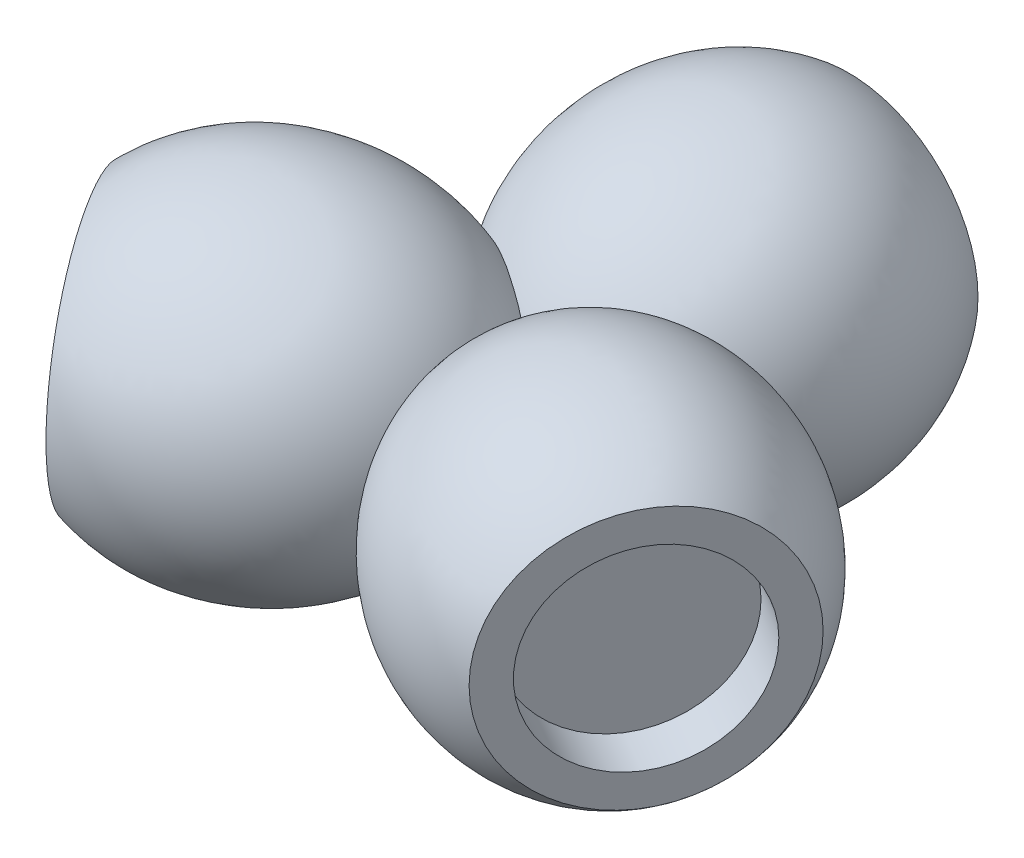
ISO-10303-21;
HEADER;
FILE_DESCRIPTION(('STEP AP214'),'2;1');
FILE_NAME('part.step','',(''),(''),'','','');
FILE_SCHEMA(('AUTOMOTIVE_DESIGN { 1 0 10303 214 1 1 1 1 }'));
ENDSEC;
DATA;
#1=APPLICATION_CONTEXT('core data for automotive mechanical design processes');
#2=APPLICATION_PROTOCOL_DEFINITION('international standard','automotive_design',2000,#1);
#3=PRODUCT_CONTEXT('',#1,'mechanical');
#4=PRODUCT('Part','Part','',(#3));
#5=PRODUCT_RELATED_PRODUCT_CATEGORY('part','',(#4));
#6=PRODUCT_DEFINITION_FORMATION('','',#4);
#7=PRODUCT_DEFINITION_CONTEXT('part definition',#1,'design');
#8=PRODUCT_DEFINITION('design','',#6,#7);
#9=PRODUCT_DEFINITION_SHAPE('','',#8);
#10=(LENGTH_UNIT() NAMED_UNIT(*) SI_UNIT(.MILLI.,.METRE.));
#11=(NAMED_UNIT(*) PLANE_ANGLE_UNIT() SI_UNIT($,.RADIAN.));
#12=(NAMED_UNIT(*) SI_UNIT($,.STERADIAN.) SOLID_ANGLE_UNIT());
#13=UNCERTAINTY_MEASURE_WITH_UNIT(LENGTH_MEASURE(1.E-05),#10,'distance_accuracy_value','');
#14=(GEOMETRIC_REPRESENTATION_CONTEXT(3) GLOBAL_UNCERTAINTY_ASSIGNED_CONTEXT((#13)) GLOBAL_UNIT_ASSIGNED_CONTEXT((#10,
#11,#12)) REPRESENTATION_CONTEXT('',''));
#15=CARTESIAN_POINT('',(0.,0.,0.));
#16=DIRECTION('',(0.,0.,1.));
#17=DIRECTION('',(1.,0.,0.));
#18=AXIS2_PLACEMENT_3D('',#15,#16,#17);
#19=CARTESIAN_POINT('',(1.21746964497283E-12,0.,111.46260013653));
#20=CARTESIAN_POINT('',(0.119663795632793,0.,111.46260013653));
#21=CARTESIAN_POINT('',(0.359418154572468,0.,111.460806702534));
#22=CARTESIAN_POINT('',(0.813396549933653,0.,111.452736250165));
#23=CARTESIAN_POINT('',(1.29199210676911,0.,111.431224933905));
#24=CARTESIAN_POINT('',(1.77179781540944,0.,111.403012927112));
#25=CARTESIAN_POINT('',(2.15418146175772,0.,111.372142779226));
#26=CARTESIAN_POINT('',(2.54742862141491,0.,111.335936552702));
#27=CARTESIAN_POINT('',(2.93713214133951,0.,111.29440521904));
#28=CARTESIAN_POINT('',(3.39173716178687,0.,111.238212731978));
#29=CARTESIAN_POINT('',(4.03916241382257,0.,111.144742729388));
#30=CARTESIAN_POINT('',(4.81289619622294,0.,111.011600029192));
#31=CARTESIAN_POINT('',(5.70991812439508,0.,110.826003494658));
#32=CARTESIAN_POINT('',(6.97978766455311,0.,110.509904393202));
#33=CARTESIAN_POINT('',(8.48204632926122,0.,110.050755161886));
#34=CARTESIAN_POINT('',(9.952102864366,0.,109.4954279195));
#35=CARTESIAN_POINT('',(11.6225674906414,0.,108.741947993922));
#36=CARTESIAN_POINT('',(13.2441001360033,0.,107.888296829864));
#37=CARTESIAN_POINT('',(14.8128252575007,0.,106.94005690529));
#38=CARTESIAN_POINT('',(16.5277569618532,0.,105.737112094324));
#39=CARTESIAN_POINT('',(18.1607810620796,0.,104.425339584756));
#40=CARTESIAN_POINT('',(19.7091654695573,0.,103.014848365321));
#41=CARTESIAN_POINT('',(21.171272091536,0.,101.515265025055));
#42=CARTESIAN_POINT('',(22.5463386816813,0.,99.9356371776898));
#43=CARTESIAN_POINT('',(24.1563398195087,0.,97.8715430642102));
#44=CARTESIAN_POINT('',(25.7407367747211,0.,95.5252173081264));
#45=CARTESIAN_POINT('',(27.2622876513046,0.,92.8895687010557));
#46=CARTESIAN_POINT('',(28.59156814644,0.,90.1532653790211));
#47=CARTESIAN_POINT('',(29.5695468367407,0.,87.8330112832781));
#48=CARTESIAN_POINT('',(30.5488001817823,0.,85.1787856860964));
#49=CARTESIAN_POINT('',(31.4832931808287,0.,82.1793690635095));
#50=CARTESIAN_POINT('',(32.3588598659516,0.,78.619288625444));
#51=CARTESIAN_POINT('',(33.2590132044147,0.,73.4602814236018));
#52=CARTESIAN_POINT('',(33.8042518059979,0.,67.1946078311029));
#53=CARTESIAN_POINT('',(33.7131138721134,0.,59.8530907527881));
#54=CARTESIAN_POINT('',(32.6919746751706,0.,51.5268964861419));
#55=CARTESIAN_POINT('',(30.8192032286581,0.,43.3515740901067));
#56=CARTESIAN_POINT('',(28.1468373255789,0.,35.4024830158736));
#57=CARTESIAN_POINT('',(24.7148897427776,0.,27.7507860460519));
#58=CARTESIAN_POINT('',(21.0719802606443,0.,21.3806075933545));
#59=CARTESIAN_POINT('',(17.5018261958731,0.,16.2063104946718));
#60=CARTESIAN_POINT('',(14.2271665120468,0.,12.1209880445207));
#61=CARTESIAN_POINT('',(11.7754989726939,0.,9.3963927044084));
#62=CARTESIAN_POINT('',(9.55698811010727,0.,7.17262355469425));
#63=CARTESIAN_POINT('',(7.76919538259728,0.,5.53549047653436));
#64=CARTESIAN_POINT('',(6.47339406391217,0.,4.42326079817697));
#65=CARTESIAN_POINT('',(5.03799194636458,0.,3.26393122614762));
#66=CARTESIAN_POINT('',(3.82810988961921,0.,2.35734358756431));
#67=CARTESIAN_POINT('',(2.70089524588899,0.,1.5761044842962));
#68=CARTESIAN_POINT('',(1.66134522589941,0.,0.917684938021807));
#69=CARTESIAN_POINT('',(1.0905943440891,0.,0.577144213723487));
#70=CARTESIAN_POINT('',(0.593460457008534,0.,0.298966802230689));
#71=CARTESIAN_POINT('',(0.256786725815097,0.,0.123170174141032));
#72=CARTESIAN_POINT('',(0.0860041808827817,0.,0.0402285197195553));
#73=CARTESIAN_POINT('',(0.,0.,0.));
#74=B_SPLINE_CURVE_WITH_KNOTS('',4,(#19,#20,#21,#22,#23,#24,#25,#26,#27,#28,#29,#30,#31,#32,#33,
#34,#35,#36,#37,#38,#39,#40,#41,#42,#43,#44,#45,#46,#47,#48,#49,#50,#51,#52,#53,#54,#55,#56,#57,
#58,#59,#60,#61,#62,#63,#64,#65,#66,#67,#68,#69,#70,#71,#72,#73),.UNSPECIFIED.,.F.,.F.,(5,1,1,1,
1,1,1,1,1,1,1,1,1,1,1,1,1,1,1,1,1,1,1,1,1,1,1,1,1,1,1,1,1,1,1,1,1,1,1,1,1,1,1,1,1,1,1,1,1,1,1,
5),(0.0853246715427618,0.0887485509040368,0.0921724302653117,0.0955963096265867,
0.0990201889878616,0.100732128668499,0.102444068349137,0.105867947710412,0.109291827071686,
0.112715706432961,0.119563473031121,0.12641123962928,0.133259006227439,0.14695454522692,
0.160650090029563,0.167497862430884,0.181193345776511,0.194888829122138,0.208584415628072,
0.222280002134007,0.235975530838741,0.249671059543476,0.263366620179581,0.277062180815685,
0.304453170294509,0.323693004216435,0.342932838138361,0.356628382317244,0.370323926496127,
0.397715014853894,0.425106104514257,0.45249719417462,0.507279373703119,0.562061567924162,
0.616843748917064,0.67162593046471,0.726408051134821,0.781190345492604,0.835972549580629,
0.863363608938114,0.8907546682956,0.918145813941736,0.931841386764804,0.945536959587871,
0.954183704686658,0.962830449785445,0.980123939983018,0.985092954987263,0.990061969991509,
0.995030984995754,0.997515492497877,1.),.UNSPECIFIED.);
#75=CARTESIAN_POINT('',(0.,0.,0.));
#76=DIRECTION('',(0.,0.,-1.));
#77=AXIS1_PLACEMENT('',#75,#76);
#78=SURFACE_OF_REVOLUTION('',#74,#77);
#79=CARTESIAN_POINT('',(0.,0.,0.));
#80=VERTEX_POINT('',#79);
#81=VERTEX_LOOP('',#80);
#82=FACE_BOUND('',#81,.T.);
#83=CARTESIAN_POINT('',(0.,0.,111.46260013653));
#84=VERTEX_POINT('',#83);
#85=VERTEX_LOOP('',#84);
#86=FACE_BOUND('',#85,.T.);
#87=ADVANCED_FACE('P0_F16',(#82,#86),#78,.T.);
#88=CLOSED_SHELL('',(#87));
#89=MANIFOLD_SOLID_BREP('P0_B1',#88);
#90=CARTESIAN_POINT('',(0.,0.,0.));
#91=CARTESIAN_POINT('',(0.043830976130994,0.,0.0186791363310697));
#92=CARTESIAN_POINT('',(0.131974543979919,0.,0.0548378624464019));
#93=CARTESIAN_POINT('',(0.31022763523346,0.,0.122268555270368));
#94=CARTESIAN_POINT('',(0.670407337037751,0.,0.246977058198205));
#95=CARTESIAN_POINT('',(1.17142801003007,0.,0.400964352623035));
#96=CARTESIAN_POINT('',(1.81561581344275,0.,0.574205655000247));
#97=CARTESIAN_POINT('',(2.75085990380028,0.,0.7924162138733));
#98=CARTESIAN_POINT('',(3.8882458320896,0.,1.0127469204612));
#99=CARTESIAN_POINT('',(5.22919551712919,0.,1.21839888894545));
#100=CARTESIAN_POINT('',(6.77394931813752,0.,1.39284942327746));
#101=CARTESIAN_POINT('',(8.72532477994025,0.,1.54457831731911));
#102=CARTESIAN_POINT('',(11.0842847706564,0.,1.6281822498997));
#103=CARTESIAN_POINT('',(13.6441193424084,0.,1.60015484439841));
#104=CARTESIAN_POINT('',(16.398680633937,0.,1.44637657097625));
#105=CARTESIAN_POINT('',(19.5281539189791,0.,1.1548953203217));
#106=CARTESIAN_POINT('',(23.0243882545599,0.,0.682393983639629));
#107=CARTESIAN_POINT('',(27.0730604900188,0.,-0.0615872578854551));
#108=CARTESIAN_POINT('',(32.7936771558061,0.,-1.4223647519291));
#109=CARTESIAN_POINT('',(39.5430024310636,0.,-3.49089860816371));
#110=CARTESIAN_POINT('',(47.2245291139392,0.,-6.46735147429374));
#111=CARTESIAN_POINT('',(57.5562927937646,0.,-11.4363848691124));
#112=CARTESIAN_POINT('',(69.4027369692584,0.,-18.5710285506906));
#113=CARTESIAN_POINT('',(82.2967202987623,0.,-28.3725054942802));
#114=CARTESIAN_POINT('',(95.6199182335728,0.,-41.2795774666161));
#115=CARTESIAN_POINT('',(107.563224066596,0.,-55.8609472479338));
#116=CARTESIAN_POINT('',(117.827965423516,0.,-71.6658797242835));
#117=CARTESIAN_POINT('',(126.341324726231,0.,-88.4773133468858));
#118=CARTESIAN_POINT('',(133.036982051647,0.,-106.090936874956));
#119=CARTESIAN_POINT('',(137.252240905113,0.,-122.030733415426));
#120=CARTESIAN_POINT('',(139.657409359358,0.,-135.946181249383));
#121=CARTESIAN_POINT('',(140.841675986377,0.,-147.647372298136));
#122=CARTESIAN_POINT('',(141.291720366522,0.,-157.045426617269));
#123=CARTESIAN_POINT('',(141.233130837806,0.,-167.630271044416));
#124=CARTESIAN_POINT('',(140.42987636832,0.,-179.367359109796));
#125=CARTESIAN_POINT('',(138.941593194893,0.,-189.854188373775));
#126=CARTESIAN_POINT('',(137.020196404185,0.,-199.065653138572));
#127=CARTESIAN_POINT('',(135.258491664991,0.,-205.896350548171));
#128=CARTESIAN_POINT('',(133.955832387977,0.,-210.415164030316));
#129=CARTESIAN_POINT('',(132.5251616505,0.,-214.895091140581));
#130=CARTESIAN_POINT('',(130.966717722194,0.,-219.332220248478));
#131=CARTESIAN_POINT('',(129.280902335316,0.,-223.722506087244));
#132=CARTESIAN_POINT('',(127.69471036426,0.,-227.519557360189));
#133=CARTESIAN_POINT('',(126.256215149428,0.,-230.739744237555));
#134=CARTESIAN_POINT('',(124.754699009714,0.,-233.931037787412));
#135=CARTESIAN_POINT('',(123.451366323489,0.,-236.565139378214));
#136=CARTESIAN_POINT('',(122.095661560921,0.,-239.173327922019));
#137=CARTESIAN_POINT('',(120.407390083382,0.,-242.269136840017));
#138=CARTESIAN_POINT('',(118.656323389429,0.,-245.331912569755));
#139=CARTESIAN_POINT('',(116.830397080705,0.,-248.347471588187));
#140=CARTESIAN_POINT('',(114.925598842458,0.,-251.319153061921));
#141=CARTESIAN_POINT('',(113.292165698358,0.,-253.757347639572));
#142=CARTESIAN_POINT('',(112.115819327361,0.,-255.454750297579));
#143=CARTESIAN_POINT('',(111.101943834626,0.,-256.880227693953));
#144=CARTESIAN_POINT('',(110.202837030668,0.,-258.114214128868));
#145=CARTESIAN_POINT('',(109.493385846108,0.,-259.075677100228));
#146=CARTESIAN_POINT('',(108.670260494782,0.,-260.164838088381));
#147=CARTESIAN_POINT('',(107.969459905131,0.,-261.083221772819));
#148=CARTESIAN_POINT('',(107.245854497313,0.,-262.007379494795));
#149=CARTESIAN_POINT('',(106.881328516675,0.,-262.469058983019));
#150=CARTESIAN_POINT('',(106.696233767227,0.,-262.701929072325));
#151=B_SPLINE_CURVE_WITH_KNOTS('',4,(#90,#91,#92,#93,#94,#95,#96,#97,#98,#99,#100,#101,#102,
#103,#104,#105,#106,#107,#108,#109,#110,#111,#112,#113,#114,#115,#116,#117,#118,#119,#120,#121,
#122,#123,#124,#125,#126,#127,#128,#129,#130,#131,#132,#133,#134,#135,#136,#137,#138,#139,#140,
#141,#142,#143,#144,#145,#146,#147,#148,#149,#150),.UNSPECIFIED.,.F.,.F.,(5,1,1,1,1,1,1,1,1,1,1,
1,1,1,1,1,1,1,1,1,1,1,1,1,1,1,1,1,1,1,1,1,1,1,1,1,1,1,1,1,1,1,1,1,1,1,1,1,1,1,1,1,1,1,1,1,1,5),
(0.,0.000496676085382172,0.000993352170764345,0.00198670434152869,0.00397340868305738,
0.00596011302458607,0.00794681736611476,0.0119979252521332,0.0160490331381516,0.02010014102417,
0.0241512489101885,0.0324007889414404,0.0406503289726922,0.046778870002393,0.0529074110320937,
0.0651644930914951,0.0774205810890931,0.0896766690866912,0.114189811680301,0.138702404650163,
0.163215230713746,0.209093251875566,0.258118854313432,0.307144114402691,0.356169607835554,
0.405195108308226,0.454220504059607,0.503245934244853,0.552271367805309,0.576784105575738,
0.601296843346166,0.625809560474281,0.650322277602395,0.687091361319528,0.723860440566191,
0.736116799570001,0.74837315857381,0.760629519262714,0.772885879951618,0.785142240640521,
0.797398601329425,0.809654959802713,0.815783139039357,0.821911318276001,0.834167676749288,
0.840295855985932,0.846424035222576,0.858680391039599,0.870936746856622,0.877064924765134,
0.883193102673645,0.889321280582157,0.892385369536413,0.895449458490668,0.898861033442164,
0.902272608393659,0.905684183345154,0.90909575829665),.UNSPECIFIED.);
#152=CARTESIAN_POINT('',(3.40249342327014E-12,0.,737.298070927678));
#153=DIRECTION('',(0.,0.,1.));
#154=AXIS1_PLACEMENT('',#152,#153);
#155=SURFACE_OF_REVOLUTION('',#151,#154);
#156=CARTESIAN_POINT('',(0.,0.,-262.701929072321));
#157=DIRECTION('',(0.,0.,1.));
#158=DIRECTION('',(1.,0.,0.));
#159=AXIS2_PLACEMENT_3D('',#156,#157,#158);
#160=CIRCLE('',#159,106.696233767229);
#161=CARTESIAN_POINT('',(106.696233767229,0.,-262.701929072322));
#162=VERTEX_POINT('',#161);
#163=EDGE_CURVE('P1_E11',#162,#162,#160,.T.);
#164=ORIENTED_EDGE('',*,*,#163,.T.);
#165=EDGE_LOOP('',(#164));
#166=FACE_BOUND('',#165,.T.);
#167=CARTESIAN_POINT('',(0.,0.,0.));
#168=VERTEX_POINT('',#167);
#169=VERTEX_LOOP('',#168);
#170=FACE_BOUND('',#169,.T.);
#171=ADVANCED_FACE('P1_F17',(#166,#170),#155,.F.);
#172=CARTESIAN_POINT('',(106.696233767229,0.,-262.701929072322));
#173=DIRECTION('',(0.,0.,-1.));
#174=DIRECTION('',(-1.,0.,0.));
#175=AXIS2_PLACEMENT_3D('',#172,#173,#174);
#176=PLANE('',#175);
#177=CARTESIAN_POINT('',(-9.01133029205691E-13,0.,-262.701929072321));
#178=DIRECTION('',(0.,0.,-1.));
#179=DIRECTION('',(-1.,0.,0.));
#180=AXIS2_PLACEMENT_3D('',#177,#178,#179);
#181=CIRCLE('',#180,80.);
#182=CARTESIAN_POINT('',(-80.0000000000009,0.,-262.701929072321));
#183=VERTEX_POINT('',#182);
#184=EDGE_CURVE('P1_E51',#183,#183,#181,.T.);
#185=ORIENTED_EDGE('',*,*,#184,.F.);
#186=EDGE_LOOP('',(#185));
#187=FACE_BOUND('',#186,.T.);
#188=ORIENTED_EDGE('',*,*,#163,.F.);
#189=EDGE_LOOP('',(#188));
#190=FACE_BOUND('',#189,.T.);
#191=ADVANCED_FACE('P1_F27',(#187,#190),#176,.T.);
#192=CARTESIAN_POINT('',(-7.6392306925026E-13,0.,-222.701929072321));
#193=DIRECTION('',(0.,0.,-1.));
#194=DIRECTION('',(-1.,0.,0.));
#195=AXIS2_PLACEMENT_3D('',#192,#193,#194);
#196=CYLINDRICAL_SURFACE('',#195,80.);
#197=CARTESIAN_POINT('',(-7.6392306925026E-13,0.,-222.701929072321));
#198=DIRECTION('',(0.,0.,-1.));
#199=DIRECTION('',(-1.,0.,0.));
#200=AXIS2_PLACEMENT_3D('',#197,#198,#199);
#201=CIRCLE('',#200,80.);
#202=CARTESIAN_POINT('',(-80.0000000000008,0.,-222.701929072321));
#203=VERTEX_POINT('',#202);
#204=EDGE_CURVE('P1_E23',#203,#203,#201,.T.);
#205=ORIENTED_EDGE('',*,*,#204,.F.);
#206=EDGE_LOOP('',(#205));
#207=FACE_BOUND('',#206,.T.);
#208=ORIENTED_EDGE('',*,*,#184,.T.);
#209=EDGE_LOOP('',(#208));
#210=FACE_BOUND('',#209,.T.);
#211=ADVANCED_FACE('P1_F33',(#207,#210),#196,.F.);
#212=CARTESIAN_POINT('',(-7.6392306925026E-13,0.,-222.701929072321));
#213=DIRECTION('',(0.,0.,-1.));
#214=DIRECTION('',(-1.,0.,0.));
#215=AXIS2_PLACEMENT_3D('',#212,#213,#214);
#216=PLANE('',#215);
#217=ORIENTED_EDGE('',*,*,#204,.T.);
#218=EDGE_LOOP('',(#217));
#219=FACE_BOUND('',#218,.T.);
#220=ADVANCED_FACE('P1_F40',(#219),#216,.T.);
#221=CLOSED_SHELL('',(#171,#191,#211,#220));
#222=MANIFOLD_SOLID_BREP('P1_B1',#221);
#223=CARTESIAN_POINT('',(96.5294432901014,0.,-55.7313000682667));
#224=CARTESIAN_POINT('',(96.4696113922855,0.,-55.8349319551969));
#225=CARTESIAN_POINT('',(96.3481810534147,0.,-56.0416686037085));
#226=CARTESIAN_POINT('',(96.1142026389624,0.,-56.430790200676));
#227=CARTESIAN_POINT('',(95.856275514195,0.,-56.834510452904));
#228=CARTESIAN_POINT('',(95.5919403453006,0.,-57.235928382071));
#229=CARTESIAN_POINT('',(95.3740141898384,0.,-57.5516472598572));
#230=CARTESIAN_POINT('',(95.1460350980644,0.,-57.8741061768242));
#231=CARTESIAN_POINT('',(94.9152161480982,0.,-58.1908336581923));
#232=CARTESIAN_POINT('',(94.6392495165768,0.,-58.5564369110566));
#233=CARTESIAN_POINT('',(94.2345894938244,0.,-59.0703886250762));
#234=CARTESIAN_POINT('',(93.732417641926,0.,-59.6738903863031));
#235=CARTESIAN_POINT('',(93.1231753640791,0.,-60.3579358965848));
#236=CARTESIAN_POINT('',(92.2144907420261,0.,-61.2996256271259));
#237=CARTESIAN_POINT('',(91.0657265112236,0.,-62.3710451781601));
#238=CARTESIAN_POINT('',(89.8497707443513,0.,-63.3664878613671));
#239=CARTESIAN_POINT('',(88.3620056744222,0.,-64.4364127010563));
#240=CARTESIAN_POINT('',(86.811955757696,0.,-65.413875582976));
#241=CARTESIAN_POINT('',(85.2063933333842,0.,-66.2983114274608));
#242=CARTESIAN_POINT('',(83.3071467155605,0.,-67.1820134437024));
#243=CARTESIAN_POINT('',(81.3546063481757,0.,-67.9403675447068));
#244=CARTESIAN_POINT('',(79.3588929165912,0.,-68.5760621666888));
#245=CARTESIAN_POINT('',(77.3291623378395,0.,-69.0924919742307));
#246=CARTESIAN_POINT('',(75.273631198423,0.,-69.4935206495091));
#247=CARTESIAN_POINT('',(72.6810726914341,0.,-69.8557754782496));
#248=CARTESIAN_POINT('',(69.8568965035055,0.,-70.0547406131003));
#249=CARTESIAN_POINT('',(66.8135824160415,0.,-70.0546180218367));
#250=CARTESIAN_POINT('',(63.7792339791321,0.,-69.8376570383619));
#251=CARTESIAN_POINT('',(61.2808456438333,0.,-69.5244843806506));
#252=CARTESIAN_POINT('',(58.4925921767783,0.,-69.0454298556067));
#253=CARTESIAN_POINT('',(55.4277746855616,0.,-68.355016221146));
#254=CARTESIAN_POINT('',(51.9068712441193,0.,-67.333238994137));
#255=CARTESIAN_POINT('',(46.9889632797856,0.,-65.5332910516264));
#256=CARTESIAN_POINT('',(41.2901114760686,0.,-62.8726447354718));
#257=CARTESIAN_POINT('',(34.977740150873,0.,-59.122958430322));
#258=CARTESIAN_POINT('',(28.2776139975844,0.,-54.0755288116463));
#259=CARTESIAN_POINT('',(22.1339628417464,0.,-48.3659999654667));
#260=CARTESIAN_POINT('',(16.586030986004,0.,-42.0771176680763));
#261=CARTESIAN_POINT('',(11.6754408194787,0.,-35.2791153920028));
#262=CARTESIAN_POINT('',(7.98015919386918,0.,-28.9391740104395));
#263=CARTESIAN_POINT('',(5.28416349206748,0.,-23.260181345582));
#264=CARTESIAN_POINT('',(3.38350030949888,0.,-18.3815816455641));
#265=CARTESIAN_POINT('',(2.2497652996054,0.,-14.8960776047947));
#266=CARTESIAN_POINT('',(1.43318015509418,0.,-11.8629062643659));
#267=CARTESIAN_POINT('',(0.909277683786906,0.,-9.49606580656119));
#268=CARTESIAN_POINT('',(0.593959186828962,0.,-7.81775410714382));
#269=CARTESIAN_POINT('',(0.30765138486681,0.,-5.99499462268695));
#270=CARTESIAN_POINT('',(0.127464487469413,0.,-4.49391220667084));
#271=CARTESIAN_POINT('',(0.0144988994745744,0.,-3.12709613804859));
#272=CARTESIAN_POINT('',(-0.0359341439524802,0.,-1.89760963909579));
#273=CARTESIAN_POINT('',(-0.0454756213128205,0.,-1.23305451406653));
#274=CARTESIAN_POINT('',(-0.0378173828842951,0.,-0.663435233026257));
#275=CARTESIAN_POINT('',(-0.0217248631128632,0.,-0.283968914981019));
#276=CARTESIAN_POINT('',(-0.00816317040761317,0.,-0.0945960653359386));
#277=CARTESIAN_POINT('',(0.,0.,0.));
#278=B_SPLINE_CURVE_WITH_KNOTS('',4,(#223,#224,#225,#226,#227,#228,#229,#230,#231,#232,#233,
#234,#235,#236,#237,#238,#239,#240,#241,#242,#243,#244,#245,#246,#247,#248,#249,#250,#251,#252,
#253,#254,#255,#256,#257,#258,#259,#260,#261,#262,#263,#264,#265,#266,#267,#268,#269,#270,#271,
#272,#273,#274,#275,#276,#277),.UNSPECIFIED.,.F.,.F.,(5,1,1,1,1,1,1,1,1,1,1,1,1,1,1,1,1,1,1,1,1,
1,1,1,1,1,1,1,1,1,1,1,1,1,1,1,1,1,1,1,1,1,1,1,1,1,1,1,1,1,1,5),(0.0853246715427618,
0.0887485509040368,0.0921724302653117,0.0955963096265867,0.0990201889878616,0.100732128668499,
0.102444068349137,0.105867947710412,0.109291827071686,0.112715706432961,0.119563473031121,
0.12641123962928,0.133259006227439,0.14695454522692,0.160650090029563,0.167497862430884,
0.181193345776511,0.194888829122138,0.208584415628072,0.222280002134007,0.235975530838741,
0.249671059543476,0.263366620179581,0.277062180815685,0.304453170294509,0.323693004216435,
0.342932838138361,0.356628382317244,0.370323926496127,0.397715014853894,0.425106104514257,
0.45249719417462,0.507279373703119,0.562061567924162,0.616843748917064,0.67162593046471,
0.726408051134821,0.781190345492604,0.835972549580629,0.863363608938114,0.8907546682956,
0.918145813941736,0.931841386764804,0.945536959587871,0.954183704686658,0.962830449785445,
0.980123939983018,0.985092954987263,0.990061969991509,0.995030984995754,0.997515492497877,1.),.UNSPECIFIED.);
#279=CARTESIAN_POINT('',(0.,0.,0.));
#280=DIRECTION('',(-0.866025403784436,0.,0.500000000000004));
#281=AXIS1_PLACEMENT('',#279,#280);
#282=SURFACE_OF_REVOLUTION('',#278,#281);
#283=CARTESIAN_POINT('',(0.,0.,0.));
#284=VERTEX_POINT('',#283);
#285=VERTEX_LOOP('',#284);
#286=FACE_BOUND('',#285,.T.);
#287=CARTESIAN_POINT('',(96.529443290102,0.,-55.7313000682657));
#288=VERTEX_POINT('',#287);
#289=VERTEX_LOOP('',#288);
#290=FACE_BOUND('',#289,.T.);
#291=ADVANCED_FACE('P2_F16',(#286,#290),#282,.T.);
#292=CLOSED_SHELL('',(#291));
#293=MANIFOLD_SOLID_BREP('P2_B1',#292);
#294=CARTESIAN_POINT('',(0.,0.,0.));
#295=CARTESIAN_POINT('',(-0.00573888148203803,0.,-0.047298306967645));
#296=CARTESIAN_POINT('',(-0.0184962900221392,0.,-0.141712238962677));
#297=CARTESIAN_POINT('',(-0.0492261426685713,0.,-0.329799290703333));
#298=CARTESIAN_POINT('',(-0.121315261967285,0.,-0.704078313857271));
#299=CARTESIAN_POINT('',(-0.23846868963151,0.,-1.21496859170221));
#300=CARTESIAN_POINT('',(-0.410531222494486,0.,-1.85947224545429));
#301=CARTESIAN_POINT('',(-0.689177380315194,0.,-2.77852266587971));
#302=CARTESIAN_POINT('',(-1.06705835532096,0.,-3.87369312697915));
#303=CARTESIAN_POINT('',(-1.55943336879513,0.,-5.1378156036623));
#304=CARTESIAN_POINT('',(-2.18073167486401,0.,-6.56283690509409));
#305=CARTESIAN_POINT('',(-3.02501832903719,0.,-8.32864207435767));
#306=CARTESIAN_POINT('',(-4.13209519492419,0.,-10.4133633191192));
#307=CARTESIAN_POINT('',(-5.4362849259665,0.,-12.6162313849915));
#308=CARTESIAN_POINT('',(-6.94674146306453,0.,-14.9248623030255));
#309=CARTESIAN_POINT('',(-8.76390827337928,0.,-17.4893250430094));
#310=CARTESIAN_POINT('',(-10.9212236020584,0.,-20.2809021268647));
#311=CARTESIAN_POINT('',(-13.5898663748878,0.,-23.4151645136063));
#312=CARTESIAN_POINT('',(-17.6286425865214,0.,-27.6889751244689));
#313=CARTESIAN_POINT('',(-22.7947080922375,0.,-32.4997953431289));
#314=CARTESIAN_POINT('',(-29.2131552289109,0.,-37.6639661572822));
#315=CARTESIAN_POINT('',(-38.6823462209898,0.,-44.127019272499));
#316=CARTESIAN_POINT('',(-50.7843509839336,0.,-50.8190190322016));
#317=CARTESIAN_POINT('',(-65.7196706764417,0.,-57.0847976797302));
#318=CARTESIAN_POINT('',(-83.5591218603639,0.,-62.1694895647564));
#319=CARTESIAN_POINT('',(-102.158611429472,0.,-65.2220109306627));
#320=CARTESIAN_POINT('',(-120.978455137548,0.,-66.2090714708568));
#321=CARTESIAN_POINT('',(-139.794263380115,0.,-65.1761400872519));
#322=CARTESIAN_POINT('',(-158.395937470827,0.,-62.1679376620618));
#323=CARTESIAN_POINT('',(-174.307835632763,0.,-57.8485606424556));
#324=CARTESIAN_POINT('',(-187.561551189128,0.,-52.9737737072349));
#325=CARTESIAN_POINT('',(-198.287213205394,0.,-48.1487831667098));
#326=CARTESIAN_POINT('',(-206.651189181981,0.,-43.8395058731801));
#327=CARTESIAN_POINT('',(-215.788638586638,0.,-38.4963436393426));
#328=CARTESIAN_POINT('',(-225.551627782969,0.,-31.9321608303744));
#329=CARTESIAN_POINT('',(-233.889346744013,0.,-25.3998551621718));
#330=CARTESIAN_POINT('',(-240.906010841037,0.,-19.1301443482703));
#331=CARTESIAN_POINT('',(-245.940715953717,0.,-14.1891145853615));
#332=CARTESIAN_POINT('',(-249.202793585712,0.,-10.801571817919));
#333=CARTESIAN_POINT('',(-252.367188901566,0.,-7.3226110596805));
#334=CARTESIAN_POINT('',(-255.430633464723,0.,-3.75439447344605));
#335=CARTESIAN_POINT('',(-258.389824837531,0.,-0.0992926029356883));
#336=CARTESIAN_POINT('',(-260.885071713844,0.,3.17291557575063));
#337=CARTESIAN_POINT('',(-262.95458774716,0.,6.02878241370057));
#338=CARTESIAN_POINT('',(-264.967570962413,0.,8.92478030981358));
#339=CARTESIAN_POINT('',(-266.597103513084,0.,11.3705503210685));
#340=CARTESIAN_POINT('',(-268.178008668595,0.,13.8487193573863));
#341=CARTESIAN_POINT('',(-270.014922098074,0.,16.8587098044187));
#342=CARTESIAN_POINT('',(-271.791830339145,0.,19.906565909971));
#343=CARTESIAN_POINT('',(-273.490417901357,0.,22.9956439879805));
#344=CARTESIAN_POINT('',(-275.111570430442,0.,26.131088388254));
#345=CARTESIAN_POINT('',(-276.406392302008,0.,28.7647802752532));
#346=CARTESIAN_POINT('',(-277.288212938794,0.,30.6322274451898));
#347=CARTESIAN_POINT('',(-278.015774830207,0.,32.22300807636));
#348=CARTESIAN_POINT('',(-278.63488502879,0.,33.6186506267606));
#349=CARTESIAN_POINT('',(-279.112810794505,0.,34.7137848610145));
#350=CARTESIAN_POINT('',(-279.644489203394,0.,35.9712128198382));
#351=CARTESIAN_POINT('',(-280.089432509713,0.,37.0373157756817));
#352=CARTESIAN_POINT('',(-280.527973870139,0.,38.1260553021562));
#353=CARTESIAN_POINT('',(-280.745537045028,0.,38.67258380584));
#354=CARTESIAN_POINT('',(-280.854661083424,0.,38.9493156056226));
#355=B_SPLINE_CURVE_WITH_KNOTS('',4,(#294,#295,#296,#297,#298,#299,#300,#301,#302,#303,#304,
#305,#306,#307,#308,#309,#310,#311,#312,#313,#314,#315,#316,#317,#318,#319,#320,#321,#322,#323,
#324,#325,#326,#327,#328,#329,#330,#331,#332,#333,#334,#335,#336,#337,#338,#339,#340,#341,#342,
#343,#344,#345,#346,#347,#348,#349,#350,#351,#352,#353,#354),.UNSPECIFIED.,.F.,.F.,(5,1,1,1,1,1,
1,1,1,1,1,1,1,1,1,1,1,1,1,1,1,1,1,1,1,1,1,1,1,1,1,1,1,1,1,1,1,1,1,1,1,1,1,1,1,1,1,1,1,1,1,1,1,1,
1,1,1,5),(0.,0.000496676085382172,0.000993352170764345,0.00198670434152869,0.00397340868305738,
0.00596011302458607,0.00794681736611476,0.0119979252521332,0.0160490331381516,0.02010014102417,
0.0241512489101885,0.0324007889414404,0.0406503289726922,0.046778870002393,0.0529074110320937,
0.0651644930914951,0.0774205810890931,0.0896766690866912,0.114189811680301,0.138702404650163,
0.163215230713746,0.209093251875566,0.258118854313432,0.307144114402691,0.356169607835554,
0.405195108308226,0.454220504059607,0.503245934244853,0.552271367805309,0.576784105575738,
0.601296843346166,0.625809560474281,0.650322277602395,0.687091361319528,0.723860440566191,
0.736116799570001,0.74837315857381,0.760629519262714,0.772885879951618,0.785142240640521,
0.797398601329425,0.809654959802713,0.815783139039357,0.821911318276001,0.834167676749288,
0.840295855985932,0.846424035222576,0.858680391039599,0.870936746856622,0.877064924765134,
0.883193102673645,0.889321280582157,0.892385369536413,0.895449458490668,0.898861033442164,
0.902272608393659,0.905684183345154,0.90909575829665),.UNSPECIFIED.);
#356=CARTESIAN_POINT('',(638.518859584627,0.,-368.649035463845));
#357=DIRECTION('',(0.866025403784435,0.,-0.500000000000007));
#358=AXIS1_PLACEMENT('',#356,#357);
#359=SURFACE_OF_REVOLUTION('',#355,#358);
#360=CARTESIAN_POINT('',(-227.506544199808,0.,131.350964536162));
#361=DIRECTION('',(0.866025403784435,0.,-0.500000000000007));
#362=DIRECTION('',(-0.500000000000007,0.,-0.866025403784435));
#363=AXIS2_PLACEMENT_3D('',#360,#361,#362);
#364=CIRCLE('',#363,106.696233767229);
#365=CARTESIAN_POINT('',(-280.854661083423,0.,38.9493156056187));
#366=VERTEX_POINT('',#365);
#367=EDGE_CURVE('P3_E11',#366,#366,#364,.T.);
#368=ORIENTED_EDGE('',*,*,#367,.T.);
#369=EDGE_LOOP('',(#368));
#370=FACE_BOUND('',#369,.T.);
#371=CARTESIAN_POINT('',(0.,0.,0.));
#372=VERTEX_POINT('',#371);
#373=VERTEX_LOOP('',#372);
#374=FACE_BOUND('',#373,.T.);
#375=ADVANCED_FACE('P3_F17',(#370,#374),#359,.F.);
#376=CARTESIAN_POINT('',(-280.854661083423,0.,38.9493156056188));
#377=DIRECTION('',(-0.866025403784435,0.,0.500000000000007));
#378=DIRECTION('',(0.500000000000007,0.,0.866025403784435));
#379=AXIS2_PLACEMENT_3D('',#376,#377,#378);
#380=PLANE('',#379);
#381=CARTESIAN_POINT('',(-227.506544199807,0.,131.350964536163));
#382=DIRECTION('',(-0.866025403784435,0.,0.500000000000007));
#383=DIRECTION('',(0.500000000000007,0.,0.866025403784435));
#384=AXIS2_PLACEMENT_3D('',#381,#382,#383);
#385=CIRCLE('',#384,80.);
#386=CARTESIAN_POINT('',(-187.506544199807,0.,200.632996838917));
#387=VERTEX_POINT('',#386);
#388=EDGE_CURVE('P3_E51',#387,#387,#385,.T.);
#389=ORIENTED_EDGE('',*,*,#388,.F.);
#390=EDGE_LOOP('',(#389));
#391=FACE_BOUND('',#390,.T.);
#392=ORIENTED_EDGE('',*,*,#367,.F.);
#393=EDGE_LOOP('',(#392));
#394=FACE_BOUND('',#393,.T.);
#395=ADVANCED_FACE('P3_F27',(#391,#394),#380,.T.);
#396=CARTESIAN_POINT('',(-192.86552804843,0.,111.350964536162));
#397=DIRECTION('',(-0.866025403784435,0.,0.500000000000007));
#398=DIRECTION('',(0.500000000000007,0.,0.866025403784435));
#399=AXIS2_PLACEMENT_3D('',#396,#397,#398);
#400=CYLINDRICAL_SURFACE('',#399,80.);
#401=CARTESIAN_POINT('',(-192.86552804843,0.,111.350964536162));
#402=DIRECTION('',(-0.866025403784435,0.,0.500000000000007));
#403=DIRECTION('',(0.500000000000007,0.,0.866025403784435));
#404=AXIS2_PLACEMENT_3D('',#401,#402,#403);
#405=CIRCLE('',#404,80.);
#406=CARTESIAN_POINT('',(-152.865528048429,0.,180.632996838917));
#407=VERTEX_POINT('',#406);
#408=EDGE_CURVE('P3_E23',#407,#407,#405,.T.);
#409=ORIENTED_EDGE('',*,*,#408,.F.);
#410=EDGE_LOOP('',(#409));
#411=FACE_BOUND('',#410,.T.);
#412=ORIENTED_EDGE('',*,*,#388,.T.);
#413=EDGE_LOOP('',(#412));
#414=FACE_BOUND('',#413,.T.);
#415=ADVANCED_FACE('P3_F33',(#411,#414),#400,.F.);
#416=CARTESIAN_POINT('',(-192.86552804843,0.,111.350964536162));
#417=DIRECTION('',(-0.866025403784435,0.,0.500000000000007));
#418=DIRECTION('',(0.500000000000007,0.,0.866025403784435));
#419=AXIS2_PLACEMENT_3D('',#416,#417,#418);
#420=PLANE('',#419);
#421=ORIENTED_EDGE('',*,*,#408,.T.);
#422=EDGE_LOOP('',(#421));
#423=FACE_BOUND('',#422,.T.);
#424=ADVANCED_FACE('P3_F40',(#423),#420,.T.);
#425=CLOSED_SHELL('',(#375,#395,#415,#424));
#426=MANIFOLD_SOLID_BREP('P3_B1',#425);
#427=CARTESIAN_POINT('',(-96.5294432901033,0.,-55.7313000682633));
#428=CARTESIAN_POINT('',(-96.5892751879191,0.,-55.627668181333));
#429=CARTESIAN_POINT('',(-96.707599207988,0.,-55.419138098825));
#430=CARTESIAN_POINT('',(-96.9275991888968,0.,-55.0219460494883));
#431=CARTESIAN_POINT('',(-97.1482676209649,0.,-54.5967144810006));
#432=CARTESIAN_POINT('',(-97.3637381607107,0.,-54.1670845450409));
#433=CARTESIAN_POINT('',(-97.5281956515969,0.,-53.8204955193685));
#434=CARTESIAN_POINT('',(-97.69346371948,0.,-53.461830375877));
#435=CARTESIAN_POINT('',(-97.8523482894384,0.,-53.1035715608474));
#436=CARTESIAN_POINT('',(-98.0309866783644,0.,-52.6817758209209));
#437=CARTESIAN_POINT('',(-98.2737519076477,0.,-52.0743541043116));
#438=CARTESIAN_POINT('',(-98.5453138381497,0.,-51.3377096428886));
#439=CARTESIAN_POINT('',(-98.8330934884749,0.,-50.4680675980728));
#440=CARTESIAN_POINT('',(-99.1942784065799,0.,-49.2102787660761));
#441=CARTESIAN_POINT('',(-99.5477728404856,0.,-47.6797099837252));
#442=CARTESIAN_POINT('',(-99.801873608718,0.,-46.128940058132));
#443=CARTESIAN_POINT('',(-99.9845731650643,0.,-44.3055352928657));
#444=CARTESIAN_POINT('',(-100.0560558937,0.,-42.474421246887));
#445=CARTESIAN_POINT('',(-100.019218590886,0.,-40.6417454778288));
#446=CARTESIAN_POINT('',(-99.8349036774144,0.,-38.555098650621));
#447=CARTESIAN_POINT('',(-99.5153874102559,0.,-36.484972040049));
#448=CARTESIAN_POINT('',(-99.0680583861492,0.,-34.4387861986321));
#449=CARTESIAN_POINT('',(-98.5004344293761,0.,-32.4227730508241));
#450=CARTESIAN_POINT('',(-97.8199698801049,0.,-30.4421165281802));
#451=CARTESIAN_POINT('',(-96.8374125109434,0.,-28.01576758596));
#452=CARTESIAN_POINT('',(-95.5976332782271,0.,-25.4704766950255));
#453=CARTESIAN_POINT('',(-94.0758700673466,0.,-22.8349506792184));
#454=CARTESIAN_POINT('',(-92.3708021255726,0.,-20.3156083406587));
#455=CARTESIAN_POINT('',(-90.8503924805746,0.,-18.3085269026269));
#456=CARTESIAN_POINT('',(-89.0413923585611,0.,-16.1333558304892));
#457=CARTESIAN_POINT('',(-86.9110678663906,0.,-13.8243528423629));
#458=CARTESIAN_POINT('',(-84.2657311100713,0.,-11.2860496313064));
#459=CARTESIAN_POINT('',(-80.2479764842007,0.,-7.92699037197489));
#460=CARTESIAN_POINT('',(-75.0943632820669,0.,-4.32196309563057));
#461=CARTESIAN_POINT('',(-68.6908540229867,0.,-0.730132322465611));
#462=CARTESIAN_POINT('',(-60.9695886727553,0.,2.54863232550489));
#463=CARTESIAN_POINT('',(-52.9531660704046,0.,5.01442587536043));
#464=CARTESIAN_POINT('',(-44.7328683115831,0.,6.674634652203));
#465=CARTESIAN_POINT('',(-36.3903305622564,0.,7.52832934595122));
#466=CARTESIAN_POINT('',(-29.0521394545136,0.,7.55856641708523));
#467=CARTESIAN_POINT('',(-22.7859896879406,0.,7.05387085091036));
#468=CARTESIAN_POINT('',(-17.6106668215457,0.,6.26059360104359));
#469=CARTESIAN_POINT('',(-14.0252642722994,0.,5.49968490038644));
#470=CARTESIAN_POINT('',(-10.9901682652015,0.,4.69028270967171));
#471=CARTESIAN_POINT('',(-8.67847306638419,0.,3.9605753300269));
#472=CARTESIAN_POINT('',(-7.06735325074114,0.,3.39449330896691));
#473=CARTESIAN_POINT('',(-5.34564333123139,0.,2.73106339653938));
#474=CARTESIAN_POINT('',(-3.95557437708863,0.,2.13656861910656));
#475=CARTESIAN_POINT('',(-2.71539414536356,0.,1.55099165375241));
#476=CARTESIAN_POINT('',(-1.62541108194693,0.,0.979924701073996));
#477=CARTESIAN_POINT('',(-1.04511872277628,0.,0.655910300343054));
#478=CARTESIAN_POINT('',(-0.555643074124238,0.,0.364468430795574));
#479=CARTESIAN_POINT('',(-0.235061862702233,0.,0.160798740839989));
#480=CARTESIAN_POINT('',(-0.0778410104751685,0.,0.054367545616384));
#481=CARTESIAN_POINT('',(0.,0.,0.));
#482=B_SPLINE_CURVE_WITH_KNOTS('',4,(#427,#428,#429,#430,#431,#432,#433,#434,#435,#436,#437,
#438,#439,#440,#441,#442,#443,#444,#445,#446,#447,#448,#449,#450,#451,#452,#453,#454,#455,#456,
#457,#458,#459,#460,#461,#462,#463,#464,#465,#466,#467,#468,#469,#470,#471,#472,#473,#474,#475,
#476,#477,#478,#479,#480,#481),.UNSPECIFIED.,.F.,.F.,(5,1,1,1,1,1,1,1,1,1,1,1,1,1,1,1,1,1,1,1,1,
1,1,1,1,1,1,1,1,1,1,1,1,1,1,1,1,1,1,1,1,1,1,1,1,1,1,1,1,1,1,5),(0.0853246715427618,
0.0887485509040368,0.0921724302653117,0.0955963096265867,0.0990201889878616,0.100732128668499,
0.102444068349137,0.105867947710412,0.109291827071686,0.112715706432961,0.119563473031121,
0.12641123962928,0.133259006227439,0.14695454522692,0.160650090029563,0.167497862430884,
0.181193345776511,0.194888829122138,0.208584415628072,0.222280002134007,0.235975530838741,
0.249671059543476,0.263366620179581,0.277062180815685,0.304453170294509,0.323693004216435,
0.342932838138361,0.356628382317244,0.370323926496127,0.397715014853894,0.425106104514257,
0.45249719417462,0.507279373703119,0.562061567924162,0.616843748917064,0.67162593046471,
0.726408051134821,0.781190345492604,0.835972549580629,0.863363608938114,0.8907546682956,
0.918145813941736,0.931841386764804,0.945536959587871,0.954183704686658,0.962830449785445,
0.980123939983018,0.985092954987263,0.990061969991509,0.995030984995754,0.997515492497877,1.),.UNSPECIFIED.);
#483=CARTESIAN_POINT('',(0.,0.,0.));
#484=DIRECTION('',(0.866025403784443,0.,0.499999999999992));
#485=AXIS1_PLACEMENT('',#483,#484);
#486=SURFACE_OF_REVOLUTION('',#482,#485);
#487=CARTESIAN_POINT('',(0.,0.,0.));
#488=VERTEX_POINT('',#487);
#489=VERTEX_LOOP('',#488);
#490=FACE_BOUND('',#489,.T.);
#491=CARTESIAN_POINT('',(-96.5294432901027,0.,-55.7313000682643));
#492=VERTEX_POINT('',#491);
#493=VERTEX_LOOP('',#492);
#494=FACE_BOUND('',#493,.T.);
#495=ADVANCED_FACE('P4_F15',(#490,#494),#486,.T.);
#496=CLOSED_SHELL('',(#495));
#497=MANIFOLD_SOLID_BREP('P4_B1',#496);
#498=CARTESIAN_POINT('',(0.,0.,0.));
#499=CARTESIAN_POINT('',(-0.038092094648956,0.,0.0286191706365757));
#500=CARTESIAN_POINT('',(-0.113478253957779,0.,0.0868743765162762));
#501=CARTESIAN_POINT('',(-0.261001492564888,0.,0.207530735432967));
#502=CARTESIAN_POINT('',(-0.549092075070465,0.,0.457101255659071));
#503=CARTESIAN_POINT('',(-0.932959320398557,0.,0.814004239079183));
#504=CARTESIAN_POINT('',(-1.40508459094826,0.,1.28526659045406));
#505=CARTESIAN_POINT('',(-2.06168252348508,0.,1.98610645200643));
#506=CARTESIAN_POINT('',(-2.82118747676863,0.,2.86094620651798));
#507=CARTESIAN_POINT('',(-3.66976214833405,0.,3.91941671471689));
#508=CARTESIAN_POINT('',(-4.5932176432735,0.,5.16998748181669));
#509=CARTESIAN_POINT('',(-5.70030645090304,0.,6.78406375703862));
#510=CARTESIAN_POINT('',(-6.95218957573214,0.,8.78518106921961));
#511=CARTESIAN_POINT('',(-8.20783441644185,0.,11.0160765405932));
#512=CARTESIAN_POINT('',(-9.45193917087244,0.,13.4784857320493));
#513=CARTESIAN_POINT('',(-10.7642456455998,0.,16.3344297226878));
#514=CARTESIAN_POINT('',(-12.1031646525013,0.,19.5985081432252));
#515=CARTESIAN_POINT('',(-13.483194115131,0.,23.476751771492));
#516=CARTESIAN_POINT('',(-15.1650345692846,0.,29.1113398763982));
#517=CARTESIAN_POINT('',(-16.7482943388259,0.,35.9906939512929));
#518=CARTESIAN_POINT('',(-18.0113738850281,0.,44.1313176315763));
#519=CARTESIAN_POINT('',(-18.8739465727745,0.,55.5634041416118));
#520=CARTESIAN_POINT('',(-18.6183859853243,0.,69.3900475828927));
#521=CARTESIAN_POINT('',(-16.5770496223201,0.,85.4573031740109));
#522=CARTESIAN_POINT('',(-12.0607963732082,0.,103.449067031373));
#523=CARTESIAN_POINT('',(-5.40461263712388,0.,121.082958178597));
#524=CARTESIAN_POINT('',(3.15048971403301,0.,137.874951195141));
#525=CARTESIAN_POINT('',(13.4529386538848,0.,153.653453434138));
#526=CARTESIAN_POINT('',(25.3589554191813,0.,168.258874537018));
#527=CARTESIAN_POINT('',(37.055594727651,0.,179.879294057883));
#528=CARTESIAN_POINT('',(47.9041418297715,0.,188.919954956618));
#529=CARTESIAN_POINT('',(57.4455372190184,0.,195.796155464847));
#530=CARTESIAN_POINT('',(65.3594688154602,0.,200.884932490449));
#531=CARTESIAN_POINT('',(74.555507748834,0.,206.126614683759));
#532=CARTESIAN_POINT('',(85.121751414651,0.,211.29951994017));
#533=CARTESIAN_POINT('',(94.9477535491212,0.,215.254043535947));
#534=CARTESIAN_POINT('',(103.885814436854,0.,218.195797486842));
#535=CARTESIAN_POINT('',(110.682224288728,0.,220.085465133532));
#536=CARTESIAN_POINT('',(115.246961197737,0.,221.216735848235));
#537=CARTESIAN_POINT('',(119.842027251068,0.,222.217702200262));
#538=CARTESIAN_POINT('',(124.46391574253,0.,223.086614721924));
#539=CARTESIAN_POINT('',(129.108922502216,0.,223.82179869018));
#540=CARTESIAN_POINT('',(133.190361349587,0.,224.346641784438));
#541=CARTESIAN_POINT('',(136.698372597735,0.,224.710961823854));
#542=CARTESIAN_POINT('',(140.212871952701,0.,225.006257477598));
#543=CARTESIAN_POINT('',(143.145737189598,0.,225.194589057146));
#544=CARTESIAN_POINT('',(146.082347107676,0.,225.324608564633));
#545=CARTESIAN_POINT('',(149.607532014694,0.,225.410427035598));
#546=CARTESIAN_POINT('',(153.135506949718,0.,225.425346659783));
#547=CARTESIAN_POINT('',(156.660020820653,0.,225.351827600206));
#548=CARTESIAN_POINT('',(160.185971587987,0.,225.188064673667));
#549=CARTESIAN_POINT('',(163.114226603652,0.,224.992567364319));
#550=CARTESIAN_POINT('',(165.172393611435,0.,224.822522852389));
#551=CARTESIAN_POINT('',(166.913830995583,0.,224.657219617593));
#552=CARTESIAN_POINT('',(168.432047998124,0.,224.495563502107));
#553=CARTESIAN_POINT('',(169.6194249484,0.,224.361892239213));
#554=CARTESIAN_POINT('',(170.974228708615,0.,224.193625268543));
#555=CARTESIAN_POINT('',(172.119972604584,0.,224.045905997137));
#556=CARTESIAN_POINT('',(173.282119372828,0.,223.881324192639));
#557=CARTESIAN_POINT('',(173.864208528355,0.,223.796475177178));
#558=CARTESIAN_POINT('',(174.1584273162,0.,223.752613466702));
#559=B_SPLINE_CURVE_WITH_KNOTS('',4,(#498,#499,#500,#501,#502,#503,#504,#505,#506,#507,#508,
#509,#510,#511,#512,#513,#514,#515,#516,#517,#518,#519,#520,#521,#522,#523,#524,#525,#526,#527,
#528,#529,#530,#531,#532,#533,#534,#535,#536,#537,#538,#539,#540,#541,#542,#543,#544,#545,#546,
#547,#548,#549,#550,#551,#552,#553,#554,#555,#556,#557,#558),.UNSPECIFIED.,.F.,.F.,(5,1,1,1,1,1,
1,1,1,1,1,1,1,1,1,1,1,1,1,1,1,1,1,1,1,1,1,1,1,1,1,1,1,1,1,1,1,1,1,1,1,1,1,1,1,1,1,1,1,1,1,1,1,1,
1,1,1,5),(0.,0.000496676085382172,0.000993352170764345,0.00198670434152869,0.00397340868305738,
0.00596011302458607,0.00794681736611476,0.0119979252521332,0.0160490331381516,0.02010014102417,
0.0241512489101885,0.0324007889414404,0.0406503289726922,0.046778870002393,0.0529074110320937,
0.0651644930914951,0.0774205810890931,0.0896766690866912,0.114189811680301,0.138702404650163,
0.163215230713746,0.209093251875566,0.258118854313432,0.307144114402691,0.356169607835554,
0.405195108308226,0.454220504059607,0.503245934244853,0.552271367805309,0.576784105575738,
0.601296843346166,0.625809560474281,0.650322277602395,0.687091361319528,0.723860440566191,
0.736116799570001,0.74837315857381,0.760629519262714,0.772885879951618,0.785142240640521,
0.797398601329425,0.809654959802713,0.815783139039357,0.821911318276001,0.834167676749288,
0.840295855985932,0.846424035222576,0.858680391039599,0.870936746856622,0.877064924765134,
0.883193102673645,0.889321280582157,0.892385369536413,0.895449458490668,0.898861033442164,
0.902272608393659,0.905684183345154,0.90909575829665),.UNSPECIFIED.);
#560=CARTESIAN_POINT('',(-638.518859584635,0.,-368.64903546383));
#561=DIRECTION('',(-0.866025403784445,0.,-0.499999999999989));
#562=AXIS1_PLACEMENT('',#560,#561);
#563=SURFACE_OF_REVOLUTION('',#559,#562);
#564=CARTESIAN_POINT('',(227.506544199809,0.,131.350964536159));
#565=DIRECTION('',(-0.866025403784445,0.,-0.499999999999989));
#566=DIRECTION('',(-0.499999999999989,0.,0.866025403784445));
#567=AXIS2_PLACEMENT_3D('',#564,#565,#566);
#568=CIRCLE('',#567,106.696233767229);
#569=CARTESIAN_POINT('',(174.158427316196,0.,223.752613466703));
#570=VERTEX_POINT('',#569);
#571=EDGE_CURVE('P5_E11',#570,#570,#568,.T.);
#572=ORIENTED_EDGE('',*,*,#571,.T.);
#573=EDGE_LOOP('',(#572));
#574=FACE_BOUND('',#573,.T.);
#575=CARTESIAN_POINT('',(0.,0.,0.));
#576=VERTEX_POINT('',#575);
#577=VERTEX_LOOP('',#576);
#578=FACE_BOUND('',#577,.T.);
#579=ADVANCED_FACE('P5_F17',(#574,#578),#563,.F.);
#580=CARTESIAN_POINT('',(174.158427316196,0.,223.752613466703));
#581=DIRECTION('',(0.866025403784445,0.,0.499999999999989));
#582=DIRECTION('',(0.499999999999989,0.,-0.866025403784445));
#583=AXIS2_PLACEMENT_3D('',#580,#581,#582);
#584=PLANE('',#583);
#585=CARTESIAN_POINT('',(227.50654419981,0.,131.350964536158));
#586=DIRECTION('',(0.866025403784445,0.,0.499999999999989));
#587=DIRECTION('',(0.499999999999989,0.,-0.866025403784445));
#588=AXIS2_PLACEMENT_3D('',#585,#586,#587);
#589=CIRCLE('',#588,80.);
#590=CARTESIAN_POINT('',(267.506544199809,0.,62.0689322334023));
#591=VERTEX_POINT('',#590);
#592=EDGE_CURVE('P5_E51',#591,#591,#589,.T.);
#593=ORIENTED_EDGE('',*,*,#592,.F.);
#594=EDGE_LOOP('',(#593));
#595=FACE_BOUND('',#594,.T.);
#596=ORIENTED_EDGE('',*,*,#571,.F.);
#597=EDGE_LOOP('',(#596));
#598=FACE_BOUND('',#597,.T.);
#599=ADVANCED_FACE('P5_F27',(#595,#598),#584,.T.);
#600=CARTESIAN_POINT('',(192.865528048432,0.,111.350964536158));
#601=DIRECTION('',(0.866025403784445,0.,0.499999999999989));
#602=DIRECTION('',(0.499999999999989,0.,-0.866025403784445));
#603=AXIS2_PLACEMENT_3D('',#600,#601,#602);
#604=CYLINDRICAL_SURFACE('',#603,80.);
#605=CARTESIAN_POINT('',(192.865528048432,0.,111.350964536158));
#606=DIRECTION('',(0.866025403784445,0.,0.499999999999989));
#607=DIRECTION('',(0.499999999999989,0.,-0.866025403784445));
#608=AXIS2_PLACEMENT_3D('',#605,#606,#607);
#609=CIRCLE('',#608,80.);
#610=CARTESIAN_POINT('',(232.865528048431,0.,42.0689322334027));
#611=VERTEX_POINT('',#610);
#612=EDGE_CURVE('P5_E23',#611,#611,#609,.T.);
#613=CARTESIAN_POINT('',(232.865528048431,0.,42.0689322334027));
#614=CARTESIAN_POINT('',(233.226371966675,0.,42.277265566736));
#615=CARTESIAN_POINT('',(233.587215884918,0.,42.4855989000693));
#616=CARTESIAN_POINT('',(234.308903721405,0.,42.902265566736));
#617=CARTESIAN_POINT('',(234.669747639649,0.,43.1105989000693));
#618=CARTESIAN_POINT('',(235.391435476136,0.,43.527265566736));
#619=CARTESIAN_POINT('',(235.752279394379,0.,43.7355989000693));
#620=CARTESIAN_POINT('',(236.473967230866,0.,44.152265566736));
#621=CARTESIAN_POINT('',(236.83481114911,0.,44.3605989000693));
#622=CARTESIAN_POINT('',(237.556498985597,0.,44.777265566736));
#623=CARTESIAN_POINT('',(237.91734290384,0.,44.9855989000693));
#624=CARTESIAN_POINT('',(238.639030740327,0.,45.4022655667359));
#625=CARTESIAN_POINT('',(238.999874658571,0.,45.6105989000693));
#626=CARTESIAN_POINT('',(239.721562495058,0.,46.0272655667359));
#627=CARTESIAN_POINT('',(240.082406413302,0.,46.2355989000692));
#628=CARTESIAN_POINT('',(240.804094249789,0.,46.6522655667359));
#629=CARTESIAN_POINT('',(241.164938168032,0.,46.8605989000692));
#630=CARTESIAN_POINT('',(241.886626004519,0.,47.2772655667359));
#631=CARTESIAN_POINT('',(242.247469922763,0.,47.4855989000692));
#632=CARTESIAN_POINT('',(242.96915775925,0.,47.9022655667359));
#633=CARTESIAN_POINT('',(243.330001677493,0.,48.1105989000692));
#634=CARTESIAN_POINT('',(244.05168951398,0.,48.5272655667359));
#635=CARTESIAN_POINT('',(244.412533432224,0.,48.7355989000692));
#636=CARTESIAN_POINT('',(245.134221268711,0.,49.1522655667359));
#637=CARTESIAN_POINT('',(245.495065186954,0.,49.3605989000692));
#638=CARTESIAN_POINT('',(246.216753023441,0.,49.7772655667358));
#639=CARTESIAN_POINT('',(246.577596941685,0.,49.9855989000692));
#640=CARTESIAN_POINT('',(247.299284778172,0.,50.4022655667358));
#641=CARTESIAN_POINT('',(247.660128696415,0.,50.6105989000692));
#642=CARTESIAN_POINT('',(248.381816532902,0.,51.0272655667358));
#643=CARTESIAN_POINT('',(248.742660451146,0.,51.2355989000691));
#644=CARTESIAN_POINT('',(249.464348287633,0.,51.6522655667358));
#645=CARTESIAN_POINT('',(249.825192205877,0.,51.8605989000691));
#646=CARTESIAN_POINT('',(250.546880042364,0.,52.2772655667358));
#647=CARTESIAN_POINT('',(250.907723960607,0.,52.4855989000691));
#648=CARTESIAN_POINT('',(251.629411797094,0.,52.9022655667358));
#649=CARTESIAN_POINT('',(251.990255715338,0.,53.1105989000691));
#650=CARTESIAN_POINT('',(252.711943551825,0.,53.5272655667358));
#651=CARTESIAN_POINT('',(253.072787470068,0.,53.7355989000691));
#652=CARTESIAN_POINT('',(253.794475306555,0.,54.1522655667358));
#653=CARTESIAN_POINT('',(254.155319224799,0.,54.3605989000691));
#654=CARTESIAN_POINT('',(254.877007061286,0.,54.7772655667357));
#655=CARTESIAN_POINT('',(255.237850979529,0.,54.9855989000691));
#656=CARTESIAN_POINT('',(255.959538816016,0.,55.4022655667357));
#657=CARTESIAN_POINT('',(256.32038273426,0.,55.610598900069));
#658=CARTESIAN_POINT('',(257.042070570747,0.,56.0272655667357));
#659=CARTESIAN_POINT('',(257.40291448899,0.,56.235598900069));
#660=CARTESIAN_POINT('',(258.124602325477,0.,56.6522655667357));
#661=CARTESIAN_POINT('',(258.485446243721,0.,56.860598900069));
#662=CARTESIAN_POINT('',(259.207134080208,0.,57.2772655667357));
#663=CARTESIAN_POINT('',(259.567977998452,0.,57.485598900069));
#664=CARTESIAN_POINT('',(260.289665834939,0.,57.9022655667357));
#665=CARTESIAN_POINT('',(260.650509753182,0.,58.110598900069));
#666=CARTESIAN_POINT('',(261.372197589669,0.,58.5272655667357));
#667=CARTESIAN_POINT('',(261.733041507913,0.,58.735598900069));
#668=CARTESIAN_POINT('',(262.4547293444,0.,59.1522655667357));
#669=CARTESIAN_POINT('',(262.815573262643,0.,59.360598900069));
#670=CARTESIAN_POINT('',(263.53726109913,0.,59.7772655667356));
#671=CARTESIAN_POINT('',(263.898105017374,0.,59.985598900069));
#672=CARTESIAN_POINT('',(264.619792853861,0.,60.4022655667356));
#673=CARTESIAN_POINT('',(264.980636772104,0.,60.6105989000689));
#674=CARTESIAN_POINT('',(265.702324608591,0.,61.0272655667356));
#675=CARTESIAN_POINT('',(266.063168526835,0.,61.2355989000689));
#676=CARTESIAN_POINT('',(266.784856363322,0.,61.6522655667356));
#677=CARTESIAN_POINT('',(267.145700281565,0.,61.8605989000689));
#678=CARTESIAN_POINT('',(267.506544199809,0.,62.0689322334023));
#679=B_SPLINE_CURVE_WITH_KNOTS('',3,(#613,#614,#615,#616,#617,#618,#619,#620,#621,#622,#623,
#624,#625,#626,#627,#628,#629,#630,#631,#632,#633,#634,#635,#636,#637,#638,#639,#640,#641,#642,
#643,#644,#645,#646,#647,#648,#649,#650,#651,#652,#653,#654,#655,#656,#657,#658,#659,#660,#661,
#662,#663,#664,#665,#666,#667,#668,#669,#670,#671,#672,#673,#674,#675,#676,#677,#678),
.UNSPECIFIED.,.F.,.F.,(4,2,2,2,2,2,2,2,2,2,2,2,2,2,2,2,2,2,2,2,2,2,2,2,2,2,2,2,2,2,2,2,4),(0.,
1.24999999999999,2.49999999999999,3.75000000000001,5.00000000000001,6.25000000000001,
7.50000000000001,8.75000000000001,10.,11.25,12.5,13.75,15.,16.25,17.5,18.75,20.,21.25,22.5,
23.75,25.,26.25,27.5,28.75,30.,31.25,32.5,33.75,35.,36.25,37.5,38.75,40.),.UNSPECIFIED.);
#680=EDGE_CURVE('P5_BSEAM33',#611,#591,#679,.T.);
#681=ORIENTED_EDGE('',*,*,#612,.F.);
#682=ORIENTED_EDGE('',*,*,#592,.T.);
#683=ORIENTED_EDGE('',*,*,#680,.T.);
#684=ORIENTED_EDGE('',*,*,#680,.F.);
#685=EDGE_LOOP('',(#681,#683,#682,#684));
#686=FACE_BOUND('',#685,.T.);
#687=ADVANCED_FACE('P5_F33',(#686),#604,.F.);
#688=CARTESIAN_POINT('',(192.865528048432,0.,111.350964536158));
#689=DIRECTION('',(0.866025403784445,0.,0.499999999999989));
#690=DIRECTION('',(0.499999999999989,0.,-0.866025403784445));
#691=AXIS2_PLACEMENT_3D('',#688,#689,#690);
#692=PLANE('',#691);
#693=ORIENTED_EDGE('',*,*,#612,.T.);
#694=EDGE_LOOP('',(#693));
#695=FACE_BOUND('',#694,.T.);
#696=ADVANCED_FACE('P5_F40',(#695),#692,.T.);
#697=CLOSED_SHELL('',(#579,#599,#687,#696));
#698=MANIFOLD_SOLID_BREP('P5_B1',#697);
#699=ADVANCED_BREP_SHAPE_REPRESENTATION('',(#18,#89,#222,#293,#426,#497,#698),#14);
#700=SHAPE_DEFINITION_REPRESENTATION(#9,#699);
ENDSEC;
END-ISO-10303-21;
